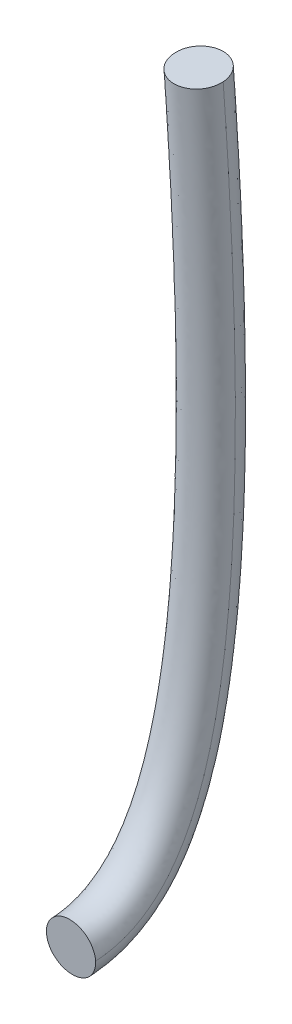
ISO-10303-21;
HEADER;
FILE_DESCRIPTION(('STEP AP214'),'2;1');
FILE_NAME('part.step','',(''),(''),'','','');
FILE_SCHEMA(('AUTOMOTIVE_DESIGN { 1 0 10303 214 1 1 1 1 }'));
ENDSEC;
DATA;
#1=APPLICATION_CONTEXT('core data for automotive mechanical design processes');
#2=APPLICATION_PROTOCOL_DEFINITION('international standard','automotive_design',2000,#1);
#3=PRODUCT_CONTEXT('',#1,'mechanical');
#4=PRODUCT('Part','Part','',(#3));
#5=PRODUCT_RELATED_PRODUCT_CATEGORY('part','',(#4));
#6=PRODUCT_DEFINITION_FORMATION('','',#4);
#7=PRODUCT_DEFINITION_CONTEXT('part definition',#1,'design');
#8=PRODUCT_DEFINITION('design','',#6,#7);
#9=PRODUCT_DEFINITION_SHAPE('','',#8);
#10=(LENGTH_UNIT() NAMED_UNIT(*) SI_UNIT(.MILLI.,.METRE.));
#11=(NAMED_UNIT(*) PLANE_ANGLE_UNIT() SI_UNIT($,.RADIAN.));
#12=(NAMED_UNIT(*) SI_UNIT($,.STERADIAN.) SOLID_ANGLE_UNIT());
#13=UNCERTAINTY_MEASURE_WITH_UNIT(LENGTH_MEASURE(1.E-05),#10,'distance_accuracy_value','');
#14=(GEOMETRIC_REPRESENTATION_CONTEXT(3) GLOBAL_UNCERTAINTY_ASSIGNED_CONTEXT((#13)) GLOBAL_UNIT_ASSIGNED_CONTEXT((#10,
#11,#12)) REPRESENTATION_CONTEXT('',''));
#15=CARTESIAN_POINT('',(0.,0.,0.));
#16=DIRECTION('',(0.,0.,1.));
#17=DIRECTION('',(1.,0.,0.));
#18=AXIS2_PLACEMENT_3D('',#15,#16,#17);
#19=CARTESIAN_POINT('',(-20.095,-7.38568943191456,11.1672900449514));
#20=CARTESIAN_POINT('',(-20.0950000000002,-7.37642950308164,10.9994364502612));
#21=CARTESIAN_POINT('',(-20.0950000000003,-7.27630877347214,10.6948030687938));
#22=CARTESIAN_POINT('',(-20.0950000000002,-6.87049510013539,10.3351984962693));
#23=CARTESIAN_POINT('',(-20.0949999999999,-6.18722354722941,10.0812505502959));
#24=CARTESIAN_POINT('',(-20.0949999999994,-5.0663907908903,9.90823706200452));
#25=CARTESIAN_POINT('',(-20.0949999999991,-3.38099483857508,9.86452069500749));
#26=CARTESIAN_POINT('',(-20.0949999999995,-1.83527381521949,9.93899557759439));
#27=CARTESIAN_POINT('',(-20.095,-1.00000001490137,10.0000001490162));
#28=CARTESIAN_POINT('',(-20.094999999999,-7.43610265920569,11.1645089135862));
#29=CARTESIAN_POINT('',(-20.0949999999992,-7.42638032085317,10.9882732782254));
#30=CARTESIAN_POINT('',(-20.0949999999993,-7.31962404199019,10.6638664476627));
#31=CARTESIAN_POINT('',(-20.0949999999992,-6.89389467970838,10.2891940375355));
#32=CARTESIAN_POINT('',(-20.0949999999989,-6.19822101169213,10.031708805105));
#33=CARTESIAN_POINT('',(-20.0949999999984,-5.0694679811965,9.85763641780434));
#34=CARTESIAN_POINT('',(-20.0949999999981,-3.37990069300922,9.8140218294083));
#35=CARTESIAN_POINT('',(-20.0949999999985,-1.83238214013708,9.88858240859414));
#36=CARTESIAN_POINT('',(-20.094999999999,-0.996322261093755,9.94964439160444));
#37=CARTESIAN_POINT('',(-20.1185408794613,-7.50309896593835,11.1608129484593));
#38=CARTESIAN_POINT('',(-20.1185408794614,-7.49276250428365,10.9734451752909));
#39=CARTESIAN_POINT('',(-20.1185408794616,-7.37718238048267,10.6227626464214));
#40=CARTESIAN_POINT('',(-20.1185408794615,-6.92499656251123,10.2280735474577));
#41=CARTESIAN_POINT('',(-20.1185408794611,-6.2128426273099,9.96588141321671));
#42=CARTESIAN_POINT('',(-20.1185408794606,-5.07356309942632,9.79039819649752));
#43=CARTESIAN_POINT('',(-20.1185408794604,-3.37845191352573,9.74691567842157));
#44=CARTESIAN_POINT('',(-20.1185408794608,-1.82853860129767,9.82158622807134));
#45=CARTESIAN_POINT('',(-20.1185408794612,-0.991434735826654,9.88272445906711));
#46=CARTESIAN_POINT('',(-20.1905198109735,-7.57470801539927,11.15686251354));
#47=CARTESIAN_POINT('',(-20.1905198109737,-7.56371580764882,10.957608111288));
#48=CARTESIAN_POINT('',(-20.1905198109739,-7.43869493343532,10.5788442956633));
#49=CARTESIAN_POINT('',(-20.1905198109738,-6.95824853134362,10.1627731364197));
#50=CARTESIAN_POINT('',(-20.1905198109734,-6.22848206711174,9.89553985647973));
#51=CARTESIAN_POINT('',(-20.1905198109729,-5.07794976484322,9.71854259979004));
#52=CARTESIAN_POINT('',(-20.1905198109726,-3.37691225707716,9.67519588624941));
#53=CARTESIAN_POINT('',(-20.1905198109731,-1.82442931009179,9.74997739545716));
#54=CARTESIAN_POINT('',(-20.1905198109735,-0.986210701015478,9.81119704221847));
#55=CARTESIAN_POINT('',(-20.2838359400474,-7.61993810085023,11.1543673190037));
#56=CARTESIAN_POINT('',(-20.2838359400476,-7.6085308165292,10.9475888746447));
#57=CARTESIAN_POINT('',(-20.2838359400477,-7.47755958158692,10.5510834690899));
#58=CARTESIAN_POINT('',(-20.2838359400476,-6.97923957441754,10.1214895967577));
#59=CARTESIAN_POINT('',(-20.2838359400472,-6.23834533096341,9.85108592762216));
#60=CARTESIAN_POINT('',(-20.2838359400468,-5.08070754372722,9.67314056235535));
#61=CARTESIAN_POINT('',(-20.2838359400465,-3.3759277969148,9.62988685871935));
#62=CARTESIAN_POINT('',(-20.2838359400469,-1.82183529217434,9.70474733637715));
#63=CARTESIAN_POINT('',(-20.2838359400474,-0.982911068599113,9.76601851798856));
#64=CARTESIAN_POINT('',(-20.4250531331411,-7.60399780868707,11.155246692313));
#65=CARTESIAN_POINT('',(-20.4250531331412,-7.59273700742057,10.9511235283243));
#66=CARTESIAN_POINT('',(-20.4250531331414,-7.46386001190605,10.5608717923496));
#67=CARTESIAN_POINT('',(-20.4250531331413,-6.97184439176497,10.1360475419484));
#68=CARTESIAN_POINT('',(-20.4250531331409,-6.23487260375516,9.8667581368968));
#69=CARTESIAN_POINT('',(-20.4250531331404,-5.07973852122901,9.68914507945094));
#70=CARTESIAN_POINT('',(-20.4250531331402,-3.37627742165249,9.64585698117916));
#71=CARTESIAN_POINT('',(-20.4250531331406,-1.82274915525147,9.72068764394964));
#72=CARTESIAN_POINT('',(-20.4250531331411,-0.984073947338514,9.78194063859798));
#73=CARTESIAN_POINT('',(-20.5519038418129,-7.47839352260481,11.1621758662303));
#74=CARTESIAN_POINT('',(-20.5519038418131,-7.4682838893931,10.9789197844376));
#75=CARTESIAN_POINT('',(-20.5519038418133,-7.35595244019467,10.6379285811908));
#76=CARTESIAN_POINT('',(-20.5519038418132,-6.91353230149173,10.2506278834698));
#77=CARTESIAN_POINT('',(-20.5519038418128,-6.20745693893595,9.99016582802587));
#78=CARTESIAN_POINT('',(-20.5519038418123,-5.07205830259422,9.81519950385096));
#79=CARTESIAN_POINT('',(-20.551903841812,-3.37899107472577,9.77166531709332));
#80=CARTESIAN_POINT('',(-20.5519038418124,-1.82995531695588,9.84629167022931));
#81=CARTESIAN_POINT('',(-20.5519038418129,-0.993237051274066,9.90740173878317));
#82=CARTESIAN_POINT('',(-20.5519945468819,-7.34852926122525,11.1693400489249));
#83=CARTESIAN_POINT('',(-20.551994546882,-7.339610102728,11.0076635563295));
#84=CARTESIAN_POINT('',(-20.5519945468822,-7.24438160762916,10.7176050020592));
#85=CARTESIAN_POINT('',(-20.5519945468821,-6.85324598486879,10.3691056129926));
#86=CARTESIAN_POINT('',(-20.5519945468817,-6.17911589185742,10.117766228878));
#87=CARTESIAN_POINT('',(-20.5519945468812,-5.06412143832557,9.94553397629857));
#88=CARTESIAN_POINT('',(-20.551994546881,-3.38180031013266,9.90174321270286));
#89=CARTESIAN_POINT('',(-20.5519945468814,-1.83740543322092,9.9761556957506));
#90=CARTESIAN_POINT('',(-20.5519945468819,-1.0027109296077,10.0371179579952));
#91=CARTESIAN_POINT('',(-20.522894693262,-7.28816587609559,11.1726700976584));
#92=CARTESIAN_POINT('',(-20.5228946932622,-7.27979990623117,11.0210211875897));
#93=CARTESIAN_POINT('',(-20.5228946932624,-7.19252355901945,10.7546362127716));
#94=CARTESIAN_POINT('',(-20.5228946932623,-6.8252215578497,10.4241691808499));
#95=CARTESIAN_POINT('',(-20.5228946932619,-6.16593962501514,10.177072757274));
#96=CARTESIAN_POINT('',(-20.5228946932614,-5.06042980875382,10.00611288753));
#97=CARTESIAN_POINT('',(-20.5228946932611,-3.38310385521081,9.96220421573651));
#98=CARTESIAN_POINT('',(-20.5228946932615,-1.8408686727417,10.0365189505498));
#99=CARTESIAN_POINT('',(-20.522894693262,-1.00711456891883,10.0974125303023));
#100=B_SPLINE_SURFACE_WITH_KNOTS('',3,3,((#19,#20,#21,#22,#23,#24,#25,#26,#27),(#28,#29,#30,#31,
#32,#33,#34,#35,#36),(#37,#38,#39,#40,#41,#42,#43,#44,#45),(#46,#47,#48,#49,#50,#51,#52,#53,
#54),(#55,#56,#57,#58,#59,#60,#61,#62,#63),(#64,#65,#66,#67,#68,#69,#70,#71,#72),(#73,#74,#75,
#76,#77,#78,#79,#80,#81),(#82,#83,#84,#85,#86,#87,#88,#89,#90),(#91,#92,#93,#94,#95,#96,#97,#98,
#99)),.UNSPECIFIED.,.F.,.F.,.F.,(4,1,1,1,1,1,4),(4,1,1,1,1,1,4),(-3.14159265358979,
-2.46839422782055,-2.24399475256414,-1.79519580205131,-1.12199737628207,-0.448798950512828,
0.448798950512828),(0.,0.142857142857143,0.285714285714286,0.428571428571429,0.571428571428571,
0.785714285714286,1.),.UNSPECIFIED.);
#101=CARTESIAN_POINT('',(-20.095,-7.38568943191456,11.1672900449514));
#102=CARTESIAN_POINT('',(-20.0950000000002,-7.37642950308164,10.9994364502612));
#103=CARTESIAN_POINT('',(-20.0950000000003,-7.27630877347214,10.6948030687938));
#104=CARTESIAN_POINT('',(-20.0950000000002,-6.87049510013539,10.3351984962693));
#105=CARTESIAN_POINT('',(-20.0949999999999,-6.18722354722941,10.0812505502959));
#106=CARTESIAN_POINT('',(-20.0949999999994,-5.0663907908903,9.90823706200452));
#107=CARTESIAN_POINT('',(-20.0949999999991,-3.38099483857508,9.86452069500749));
#108=CARTESIAN_POINT('',(-20.0949999999995,-1.83527381521949,9.93899557759439));
#109=CARTESIAN_POINT('',(-20.095,-1.00000001490137,10.0000001490162));
#110=B_SPLINE_CURVE_WITH_KNOTS('',3,(#101,#102,#103,#104,#105,#106,#107,#108,#109),
.UNSPECIFIED.,.F.,.F.,(4,1,1,1,1,1,4),(0.,0.142857142857143,0.285714285714286,0.428571428571429,
0.571428571428571,0.785714285714286,1.),.UNSPECIFIED.);
#111=CARTESIAN_POINT('',(-20.095,-7.38568943191456,11.1672900449514));
#112=VERTEX_POINT('',#111);
#113=CARTESIAN_POINT('',(-20.095,-1.00000001490137,10.0000001490162));
#114=VERTEX_POINT('',#113);
#115=EDGE_CURVE('E11',#112,#114,#110,.T.);
#116=CARTESIAN_POINT('',(-20.095,-7.38568943191456,11.1672900449514));
#117=CARTESIAN_POINT('',(-20.0949787852533,-7.41102414922409,11.1658924122125));
#118=CARTESIAN_POINT('',(-20.0994745145471,-7.43643139741167,11.1644907781844));
#119=CARTESIAN_POINT('',(-20.1164205144212,-7.48437360119493,11.1618459650307));
#120=CARTESIAN_POINT('',(-20.1288654992014,-7.50691045350495,11.1606026812697));
#121=CARTESIAN_POINT('',(-20.1606821152683,-7.54639766073257,11.1584243023711));
#122=CARTESIAN_POINT('',(-20.1800437349792,-7.56335602251393,11.1574887655212));
#123=CARTESIAN_POINT('',(-20.2230907302121,-7.58996354286209,11.1560209164394));
#124=CARTESIAN_POINT('',(-20.2467462027205,-7.5996610118049,11.1554859390835));
#125=CARTESIAN_POINT('',(-20.2960090449314,-7.6105223347791,11.1548867557419));
#126=CARTESIAN_POINT('',(-20.3216213113346,-7.61166402183564,11.1548237726351));
#127=CARTESIAN_POINT('',(-20.3718898750451,-7.60564152168545,11.1551560140917));
#128=CARTESIAN_POINT('',(-20.3965444680173,-7.59846317002508,11.1555520200613));
#129=CARTESIAN_POINT('',(-20.4420077385561,-7.57620555494576,11.156779899226));
#130=CARTESIAN_POINT('',(-20.4628109513174,-7.56111517950344,11.1576123854347));
#131=CARTESIAN_POINT('',(-20.4985084086793,-7.52495363927051,11.1596072982614));
#132=CARTESIAN_POINT('',(-20.5133795509041,-7.5038596291267,11.1607709851821));
#133=CARTESIAN_POINT('',(-20.5345565527007,-7.4582305578552,11.1632881904494));
#134=CARTESIAN_POINT('',(-20.541030889921,-7.4337744373341,11.1646373539032));
#135=CARTESIAN_POINT('',(-20.5447935152529,-7.39652884197747,11.1666920704732));
#136=CARTESIAN_POINT('',(-20.5450377919067,-7.38393551571693,11.1673868027199));
#137=CARTESIAN_POINT('',(-20.5435026766433,-7.35886092313939,11.1687700852359));
#138=CARTESIAN_POINT('',(-20.5417243046833,-7.34637960353866,11.1694586384446));
#139=CARTESIAN_POINT('',(-20.5360060562096,-7.32136042587858,11.1708388639025));
#140=CARTESIAN_POINT('',(-20.5319783910918,-7.30884228054607,11.1715294486656));
#141=CARTESIAN_POINT('',(-20.5216665107193,-7.28477315528892,11.1728572628679));
#142=CARTESIAN_POINT('',(-20.5153837224667,-7.27322156942977,11.1734945257347));
#143=CARTESIAN_POINT('',(-20.5013884574464,-7.25221121753429,11.1746535975059));
#144=CARTESIAN_POINT('',(-20.4938107298912,-7.24266179272328,11.1751804077557));
#145=CARTESIAN_POINT('',(-20.4772452160603,-7.22485203850872,11.1761629131162));
#146=CARTESIAN_POINT('',(-20.4682555348585,-7.21659347166787,11.1766185109921));
#147=CARTESIAN_POINT('',(-20.4485040125283,-7.2010928357888,11.177473629915));
#148=CARTESIAN_POINT('',(-20.4376664939654,-7.19394666345736,11.1778678606572));
#149=CARTESIAN_POINT('',(-20.4149574036094,-7.18157200387606,11.1785505297848));
#150=CARTESIAN_POINT('',(-20.4030873343405,-7.17634078598116,11.1788391188109));
#151=CARTESIAN_POINT('',(-20.3786515922653,-7.16811028275178,11.17929316851));
#152=CARTESIAN_POINT('',(-20.3660896172693,-7.16510017486018,11.1794592262277));
#153=CARTESIAN_POINT('',(-20.3406256690926,-7.16139338487544,11.1796637175972));
#154=CARTESIAN_POINT('',(-20.3277234868847,-7.16069816010581,11.1797020708532));
#155=CARTESIAN_POINT('',(-20.3027078095947,-7.16145157212326,11.1796605075988));
#156=CARTESIAN_POINT('',(-20.2905902290675,-7.16278354384755,11.1795870271148));
#157=CARTESIAN_POINT('',(-20.2667020622371,-7.16730426525065,11.1793376338352));
#158=CARTESIAN_POINT('',(-20.2549316570357,-7.17049396661399,11.1791616685383));
#159=CARTESIAN_POINT('',(-20.2311229685502,-7.17898986770055,11.1786929777153));
#160=CARTESIAN_POINT('',(-20.2191365854639,-7.18444296124271,11.178392148542));
#161=CARTESIAN_POINT('',(-20.1963309457283,-7.19736626685898,11.1776792124234));
#162=CARTESIAN_POINT('',(-20.185510054752,-7.20483360151817,11.1772672642155));
#163=CARTESIAN_POINT('',(-20.1564583285629,-7.22919631296217,11.1759232538321));
#164=CARTESIAN_POINT('',(-20.1402436484599,-7.24855475876608,11.174855312268));
#165=CARTESIAN_POINT('',(-20.1146449847708,-7.29144940133388,11.1724889564076));
#166=CARTESIAN_POINT('',(-20.1053042853076,-7.31501092984302,11.1711891446425));
#167=CARTESIAN_POINT('',(-20.0967288154895,-7.35460670267952,11.1690047765375));
#168=CARTESIAN_POINT('',(-20.0950130254519,-7.37013439621661,11.1681481649328));
#169=CARTESIAN_POINT('',(-20.095,-7.38568943191456,11.1672900449514));
#170=B_SPLINE_CURVE_WITH_KNOTS('',3,(#116,#117,#118,#119,#120,#121,#122,#123,#124,#125,#126,
#127,#128,#129,#130,#131,#132,#133,#134,#135,#136,#137,#138,#139,#140,#141,#142,#143,#144,#145,
#146,#147,#148,#149,#150,#151,#152,#153,#154,#155,#156,#157,#158,#159,#160,#161,#162,#163,#164,
#165,#166,#167,#168,#169),.UNSPECIFIED.,.T.,.F.,(4,2,2,2,2,2,2,2,2,2,2,2,2,2,2,2,2,2,2,2,2,2,2,
2,2,2,4),(0.,0.075946924818553,0.151843401775097,0.227630463546568,0.302908682089793,
0.378381869996949,0.453983736230133,0.529692066875324,0.605692429595349,0.680143008902042,
0.717866920681559,0.755571817925892,0.794862990580592,0.834129344181152,0.870581287199164,
0.907082575624797,0.945867074950958,0.984596051757179,1.02313504897368,1.06169830364758,
1.09812461500199,1.13456960339454,1.17388465055159,1.2131438295107,1.28747504664778,
1.36227039935586,1.40890037009004),.UNSPECIFIED.);
#171=CARTESIAN_POINT('',(-20.522894693262,-7.28816587609559,11.1726700976583));
#172=VERTEX_POINT('',#171);
#173=EDGE_CURVE('E46',#112,#172,#170,.T.);
#174=CARTESIAN_POINT('',(-20.522894693262,-7.28816587609559,11.1726700976584));
#175=CARTESIAN_POINT('',(-20.5228946932622,-7.27979990623117,11.0210211875897));
#176=CARTESIAN_POINT('',(-20.5228946932624,-7.19252355901945,10.7546362127716));
#177=CARTESIAN_POINT('',(-20.5228946932623,-6.8252215578497,10.4241691808499));
#178=CARTESIAN_POINT('',(-20.5228946932619,-6.16593962501514,10.177072757274));
#179=CARTESIAN_POINT('',(-20.5228946932614,-5.06042980875382,10.00611288753));
#180=CARTESIAN_POINT('',(-20.5228946932611,-3.38310385521081,9.96220421573651));
#181=CARTESIAN_POINT('',(-20.5228946932615,-1.8408686727417,10.0365189505498));
#182=CARTESIAN_POINT('',(-20.522894693262,-1.00711456891883,10.0974125303023));
#183=B_SPLINE_CURVE_WITH_KNOTS('',3,(#174,#175,#176,#177,#178,#179,#180,#181,#182),
.UNSPECIFIED.,.F.,.F.,(4,1,1,1,1,1,4),(0.,0.142857142857143,0.285714285714286,0.428571428571429,
0.571428571428571,0.785714285714286,1.),.UNSPECIFIED.);
#184=CARTESIAN_POINT('',(-20.522894693262,-1.00711456891883,10.0974125303023));
#185=VERTEX_POINT('',#184);
#186=EDGE_CURVE('E28',#172,#185,#183,.T.);
#187=CARTESIAN_POINT('',(-20.095,-1.00000001490137,10.0000001490162));
#188=CARTESIAN_POINT('',(-20.095010910668,-1.00092579997122,10.0126759861797));
#189=CARTESIAN_POINT('',(-20.096153038526,-1.00185186597768,10.0253556699235));
#190=CARTESIAN_POINT('',(-20.1005839090107,-1.00367789217191,10.0503575968806));
#191=CARTESIAN_POINT('',(-20.103877751822,-1.00457778501485,10.0626789180092));
#192=CARTESIAN_POINT('',(-20.1124215920254,-1.00632377819577,10.0865850339865));
#193=CARTESIAN_POINT('',(-20.1176658853318,-1.00717002705087,10.0981718623297));
#194=CARTESIAN_POINT('',(-20.1299670506157,-1.00878870825723,10.1203348244032));
#195=CARTESIAN_POINT('',(-20.1370226360313,-1.00956119247141,10.1309116682399));
#196=CARTESIAN_POINT('',(-20.1530470880406,-1.01103186829106,10.1510481424793));
#197=CARTESIAN_POINT('',(-20.162066927139,-1.01172714202498,10.1605678214222));
#198=CARTESIAN_POINT('',(-20.1817146182831,-1.01298380572313,10.1777740444707));
#199=CARTESIAN_POINT('',(-20.1923413907599,-1.01354528492566,10.185461810426));
#200=CARTESIAN_POINT('',(-20.2140024388855,-1.01448720499415,10.1983585677813));
#201=CARTESIAN_POINT('',(-20.2249567347001,-1.01487753385146,10.2037029454307));
#202=CARTESIAN_POINT('',(-20.2475811073547,-1.01552897798249,10.2126225100195));
#203=CARTESIAN_POINT('',(-20.2592521429699,-1.01578991574504,10.2161952664784));
#204=CARTESIAN_POINT('',(-20.2837388018219,-1.01618893511859,10.2216586345632));
#205=CARTESIAN_POINT('',(-20.2965807254182,-1.01631850148856,10.2234326556195));
#206=CARTESIAN_POINT('',(-20.3223688233111,-1.01641939270129,10.2248140567948));
#207=CARTESIAN_POINT('',(-20.3353148247128,-1.01639094082317,10.2244244940488));
#208=CARTESIAN_POINT('',(-20.3608895397899,-1.01616589923605,10.2213432275579));
#209=CARTESIAN_POINT('',(-20.373519225465,-1.01596991334819,10.2186597913243));
#210=CARTESIAN_POINT('',(-20.3980866399254,-1.01541495199549,10.2110612676841));
#211=CARTESIAN_POINT('',(-20.410023950728,-1.01505587920755,10.2061448477308));
#212=CARTESIAN_POINT('',(-20.4322659757352,-1.01422139176565,10.1947190565043));
#213=CARTESIAN_POINT('',(-20.442624420503,-1.01375348572078,10.1883124930094));
#214=CARTESIAN_POINT('',(-20.4622294450261,-1.01270649813385,10.1739771525546));
#215=CARTESIAN_POINT('',(-20.4714753877432,-1.01212735338267,10.1660475101363));
#216=CARTESIAN_POINT('',(-20.489310472966,-1.01082054884945,10.1481547594242));
#217=CARTESIAN_POINT('',(-20.4977877130672,-1.01008470957732,10.1380796576583));
#218=CARTESIAN_POINT('',(-20.5128197546161,-1.00851737512072,10.116619734616));
#219=CARTESIAN_POINT('',(-20.5193773730272,-1.00768602261982,10.1052368669612));
#220=CARTESIAN_POINT('',(-20.535126354342,-1.00516547776842,10.070725599562));
#221=CARTESIAN_POINT('',(-20.5414234611163,-1.00337435882799,10.0462016222709));
#222=CARTESIAN_POINT('',(-20.5448745682492,-1.00065795256374,10.0090086229487));
#223=CARTESIAN_POINT('',(-20.545013763641,-0.999743669154192,9.99649026636879));
#224=CARTESIAN_POINT('',(-20.5432932825874,-0.99792418717634,9.97157794273744));
#225=CARTESIAN_POINT('',(-20.5414349150704,-0.997018983050796,9.95918389959628));
#226=CARTESIAN_POINT('',(-20.535567458686,-0.995200025491965,9.93427875630341));
#227=CARTESIAN_POINT('',(-20.5314594653048,-0.994287945358832,9.92179056695569));
#228=CARTESIAN_POINT('',(-20.5210068429878,-0.992534281157569,9.89777941946743));
#229=CARTESIAN_POINT('',(-20.5146625209866,-0.991692687434835,9.88625632913619));
#230=CARTESIAN_POINT('',(-20.5005122936693,-0.990157265864198,9.8652333569146));
#231=CARTESIAN_POINT('',(-20.4928290256952,-0.989457375172944,9.85565046265175));
#232=CARTESIAN_POINT('',(-20.4760270153471,-0.988155632905384,9.83782702441571));
#233=CARTESIAN_POINT('',(-20.4669077211711,-0.987553819197408,9.82958699893521));
#234=CARTESIAN_POINT('',(-20.4470402930406,-0.986440038800147,9.81433713218834));
#235=CARTESIAN_POINT('',(-20.4362386325268,-0.985933107001194,9.80739622857508));
#236=CARTESIAN_POINT('',(-20.4135906249568,-0.985064174130083,9.79549881097918));
#237=CARTESIAN_POINT('',(-20.4017446599369,-0.984702120323717,9.79054157496045));
#238=CARTESIAN_POINT('',(-20.3776334648084,-0.984135805568633,9.78278760068245));
#239=CARTESIAN_POINT('',(-20.3653816564957,-0.983928485998675,9.77994898382086));
#240=CARTESIAN_POINT('',(-20.3405757955953,-0.983661573337219,9.77629441912384));
#241=CARTESIAN_POINT('',(-20.3280216443417,-0.983602029148455,9.77547914086399));
#242=CARTESIAN_POINT('',(-20.3026200089213,-0.983634264446903,9.77592050615224));
#243=CARTESIAN_POINT('',(-20.2897733032978,-0.983729983354262,9.77723108818985));
#244=CARTESIAN_POINT('',(-20.2645148572082,-0.984084836891747,9.78208973822075));
#245=CARTESIAN_POINT('',(-20.2521029948335,-0.984343925327841,9.78563717372596));
#246=CARTESIAN_POINT('',(-20.2284366902281,-0.98500246686738,9.79465391594033));
#247=CARTESIAN_POINT('',(-20.2171586541992,-0.985397459982596,9.80006215654853));
#248=CARTESIAN_POINT('',(-20.1956318237196,-0.986315646933908,9.81263396037178));
#249=CARTESIAN_POINT('',(-20.1853832195104,-0.986838864404937,9.819797847196));
#250=CARTESIAN_POINT('',(-20.1659610470608,-0.9880166404934,9.83592394211668));
#251=CARTESIAN_POINT('',(-20.1568215739916,-0.988674209240573,9.84492736487047));
#252=CARTESIAN_POINT('',(-20.140264114836,-0.990094271734272,9.86437084210773));
#253=CARTESIAN_POINT('',(-20.1328460448919,-0.99085676036677,9.87481082657002));
#254=CARTESIAN_POINT('',(-20.1137506351933,-0.993226277199654,9.90725422029944));
#255=CARTESIAN_POINT('',(-20.1046663683774,-0.994950867283838,9.93086728535401));
#256=CARTESIAN_POINT('',(-20.0965627924642,-0.997806182346302,9.96996222213914));
#257=CARTESIAN_POINT('',(-20.094987070172,-0.998902901353784,9.98497848455875));
#258=CARTESIAN_POINT('',(-20.095,-1.00000001490137,10.0000001490162));
#259=B_SPLINE_CURVE_WITH_KNOTS('',3,(#187,#188,#189,#190,#191,#192,#193,#194,#195,#196,#197,
#198,#199,#200,#201,#202,#203,#204,#205,#206,#207,#208,#209,#210,#211,#212,#213,#214,#215,#216,
#217,#218,#219,#220,#221,#222,#223,#224,#225,#226,#227,#228,#229,#230,#231,#232,#233,#234,#235,
#236,#237,#238,#239,#240,#241,#242,#243,#244,#245,#246,#247,#248,#249,#250,#251,#252,#253,#254,
#255,#256,#257,#258),.UNSPECIFIED.,.T.,.F.,(4,2,2,2,2,2,2,2,2,2,2,2,2,2,2,2,2,2,2,2,2,2,2,2,2,2,
2,2,2,2,2,2,2,2,2,4),(0.,0.0380914232370062,0.0762734633417878,0.114344707179933,
0.152388983454611,0.191572650355784,0.230730108912674,0.267159307597948,0.303638346042767,
0.342354406014508,0.381015774284575,0.419538385070447,0.458084014726707,0.494503796746084,
0.530944335114648,0.570303260269849,0.609604134955326,0.684073426167309,0.721621284680877,
0.759144554472874,0.798468019814324,0.837786090137553,0.87453423253579,0.911296530248761,
0.949654823299913,0.987999141570067,1.02556383073563,1.06314094938131,1.10168649515023,
1.14022114674442,1.17759583737287,1.21497742227294,1.25331264932203,1.2916460084892,
1.36617909185154,1.41131982466417),.UNSPECIFIED.);
#260=EDGE_CURVE('E47',#185,#114,#259,.T.);
#261=ORIENTED_EDGE('',*,*,#115,.F.);
#262=ORIENTED_EDGE('',*,*,#173,.T.);
#263=ORIENTED_EDGE('',*,*,#186,.T.);
#264=ORIENTED_EDGE('',*,*,#260,.T.);
#265=EDGE_LOOP('',(#261,#262,#263,#264));
#266=FACE_BOUND('',#265,.T.);
#267=ADVANCED_FACE('F16',(#266),#100,.T.);
#268=CARTESIAN_POINT('',(-20.32,-7.38568943191911,11.1672900449514));
#269=DIRECTION('',(-1.11249196396045E-12,0.0550829445172842,-0.998481782118886));
#270=DIRECTION('',(0.,0.998481782118886,0.0550829445172842));
#271=AXIS2_PLACEMENT_3D('',#268,#269,#270);
#272=PLANE('',#271);
#273=ORIENTED_EDGE('',*,*,#173,.F.);
#274=EDGE_CURVE('E49',#172,#112,#170,.T.);
#275=ORIENTED_EDGE('',*,*,#274,.F.);
#276=EDGE_LOOP('',(#273,#275));
#277=FACE_BOUND('',#276,.T.);
#278=ADVANCED_FACE('F53',(#277),#272,.F.);
#279=CARTESIAN_POINT('',(-20.32,-1.00000001490116,10.0000001490116));
#280=DIRECTION('',(-5.32623886368089E-13,0.997343536648528,0.0728414024124084));
#281=DIRECTION('',(0.,-0.0728414024124084,0.997343536648528));
#282=AXIS2_PLACEMENT_3D('',#279,#280,#281);
#283=PLANE('',#282);
#284=EDGE_CURVE('E55',#114,#185,#259,.T.);
#285=ORIENTED_EDGE('',*,*,#284,.F.);
#286=ORIENTED_EDGE('',*,*,#260,.F.);
#287=EDGE_LOOP('',(#285,#286));
#288=FACE_BOUND('',#287,.T.);
#289=ADVANCED_FACE('F83',(#288),#283,.T.);
#290=CARTESIAN_POINT('',(-20.522894693262,-7.28816587609559,11.1726700976584));
#291=CARTESIAN_POINT('',(-20.5228946932622,-7.27979990623117,11.0210211875897));
#292=CARTESIAN_POINT('',(-20.5228946932624,-7.19252355901945,10.7546362127716));
#293=CARTESIAN_POINT('',(-20.5228946932623,-6.8252215578497,10.4241691808499));
#294=CARTESIAN_POINT('',(-20.5228946932619,-6.16593962501514,10.177072757274));
#295=CARTESIAN_POINT('',(-20.5228946932614,-5.06042980875382,10.00611288753));
#296=CARTESIAN_POINT('',(-20.5228946932611,-3.38310385521081,9.96220421573651));
#297=CARTESIAN_POINT('',(-20.5228946932615,-1.8408686727417,10.0365189505498));
#298=CARTESIAN_POINT('',(-20.522894693262,-1.00711456891883,10.0974125303023));
#299=CARTESIAN_POINT('',(-20.4937948396422,-7.22780249096593,11.1760001463918));
#300=CARTESIAN_POINT('',(-20.4937948396423,-7.21998970973435,11.0343788188499));
#301=CARTESIAN_POINT('',(-20.4937948396425,-7.14066551040973,10.791667423484));
#302=CARTESIAN_POINT('',(-20.4937948396424,-6.79719713083061,10.4792327487073));
#303=CARTESIAN_POINT('',(-20.493794839642,-6.15276335817286,10.2363792856699));
#304=CARTESIAN_POINT('',(-20.4937948396415,-5.05673817918207,10.0666917987614));
#305=CARTESIAN_POINT('',(-20.4937948396413,-3.38440740028897,10.0226652187702));
#306=CARTESIAN_POINT('',(-20.4937948396417,-1.84433191226247,10.096882205349));
#307=CARTESIAN_POINT('',(-20.4937948396422,-1.01151820822996,10.1577071026094));
#308=CARTESIAN_POINT('',(-20.3772917622267,-7.1347652491668,11.1811327039605));
#309=CARTESIAN_POINT('',(-20.3772917622269,-7.12780467993573,11.0549593188714));
#310=CARTESIAN_POINT('',(-20.377291762227,-7.0607428389029,10.8487334996271));
#311=CARTESIAN_POINT('',(-20.3772917622269,-6.75399807032331,10.564083900682));
#312=CARTESIAN_POINT('',(-20.3772917622266,-6.13244805889351,10.3277763697083));
#313=CARTESIAN_POINT('',(-20.3772917622261,-5.05104236291639,10.1600537608898));
#314=CARTESIAN_POINT('',(-20.3772917622258,-3.38641102585084,10.1158487787796));
#315=CARTESIAN_POINT('',(-20.3772917622262,-1.84967045175695,10.1899191953785));
#316=CARTESIAN_POINT('',(-20.3772917622267,-1.01830547595034,10.2506382841669));
#317=CARTESIAN_POINT('',(-20.1593966656056,-7.18477602877564,11.1783737743054));
#318=CARTESIAN_POINT('',(-20.1593966656058,-7.17735811861405,11.0439102262394));
#319=CARTESIAN_POINT('',(-20.159396665606,-7.10369413294862,10.8180761365189));
#320=CARTESIAN_POINT('',(-20.1593966656059,-6.77722900373821,10.5185056766632));
#321=CARTESIAN_POINT('',(-20.1593966656055,-6.14338092437212,10.278667876189));
#322=CARTESIAN_POINT('',(-20.159396665605,-5.0541150094898,10.1098821478649));
#323=CARTESIAN_POINT('',(-20.1593966656048,-3.38534412785178,10.0657669501631));
#324=CARTESIAN_POINT('',(-20.1593966656052,-1.8467995196919,10.1399086445829));
#325=CARTESIAN_POINT('',(-20.1593966656056,-1.0146570815702,10.2006845156567));
#326=CARTESIAN_POINT('',(-20.0950000000014,-7.31847179552639,11.170998220105));
#327=CARTESIAN_POINT('',(-20.0950000000015,-7.30982729388697,11.0143003987002));
#328=CARTESIAN_POINT('',(-20.0950000000017,-7.21856985948618,10.7360256630316));
#329=CARTESIAN_POINT('',(-20.0950000000016,-6.83928091377311,10.3964898571407));
#330=CARTESIAN_POINT('',(-20.0950000000012,-6.1725414187144,10.147275533278));
#331=CARTESIAN_POINT('',(-20.0950000000008,-5.06227160496879,9.97568420649277));
#332=CARTESIAN_POINT('',(-20.0950000000005,-3.38243865923538,9.93184121877158));
#333=CARTESIAN_POINT('',(-20.0950000000009,-1.83913128396929,10.00621299735));
#334=CARTESIAN_POINT('',(-20.0950000000014,-1.00490368664485,10.0671411588984));
#335=CARTESIAN_POINT('',(-20.095,-7.38568943191456,11.1672900449514));
#336=CARTESIAN_POINT('',(-20.0950000000002,-7.37642950308164,10.9994364502612));
#337=CARTESIAN_POINT('',(-20.0950000000003,-7.27630877347214,10.6948030687938));
#338=CARTESIAN_POINT('',(-20.0950000000002,-6.87049510013539,10.3351984962693));
#339=CARTESIAN_POINT('',(-20.0949999999999,-6.18722354722941,10.0812505502959));
#340=CARTESIAN_POINT('',(-20.0949999999994,-5.0663907908903,9.90823706200452));
#341=CARTESIAN_POINT('',(-20.0949999999991,-3.38099483857508,9.86452069500749));
#342=CARTESIAN_POINT('',(-20.0949999999995,-1.83527381521949,9.93899557759439));
#343=CARTESIAN_POINT('',(-20.095,-1.00000001490137,10.0000001490162));
#344=B_SPLINE_SURFACE_WITH_KNOTS('',3,3,((#290,#291,#292,#293,#294,#295,#296,#297,#298),(#299,
#300,#301,#302,#303,#304,#305,#306,#307),(#308,#309,#310,#311,#312,#313,#314,#315,#316),(#317,
#318,#319,#320,#321,#322,#323,#324,#325),(#326,#327,#328,#329,#330,#331,#332,#333,#334),(#335,
#336,#337,#338,#339,#340,#341,#342,#343)),.UNSPECIFIED.,.F.,.F.,.F.,(4,1,1,4),(4,1,1,1,1,1,4),
(0.448798950512828,1.34639685153848,2.24399475256414,3.14159265358979),(0.,0.142857142857143,
0.285714285714286,0.428571428571429,0.571428571428571,0.785714285714286,1.),.UNSPECIFIED.);
#345=ORIENTED_EDGE('',*,*,#274,.T.);
#346=ORIENTED_EDGE('',*,*,#115,.T.);
#347=ORIENTED_EDGE('',*,*,#284,.T.);
#348=ORIENTED_EDGE('',*,*,#186,.F.);
#349=EDGE_LOOP('',(#345,#346,#347,#348));
#350=FACE_BOUND('',#349,.T.);
#351=ADVANCED_FACE('F50',(#350),#344,.T.);
#352=CLOSED_SHELL('',(#267,#278,#289,#351));
#353=MANIFOLD_SOLID_BREP('B1',#352);
#354=ADVANCED_BREP_SHAPE_REPRESENTATION('',(#18,#353),#14);
#355=SHAPE_DEFINITION_REPRESENTATION(#9,#354);
ENDSEC;
END-ISO-10303-21;
